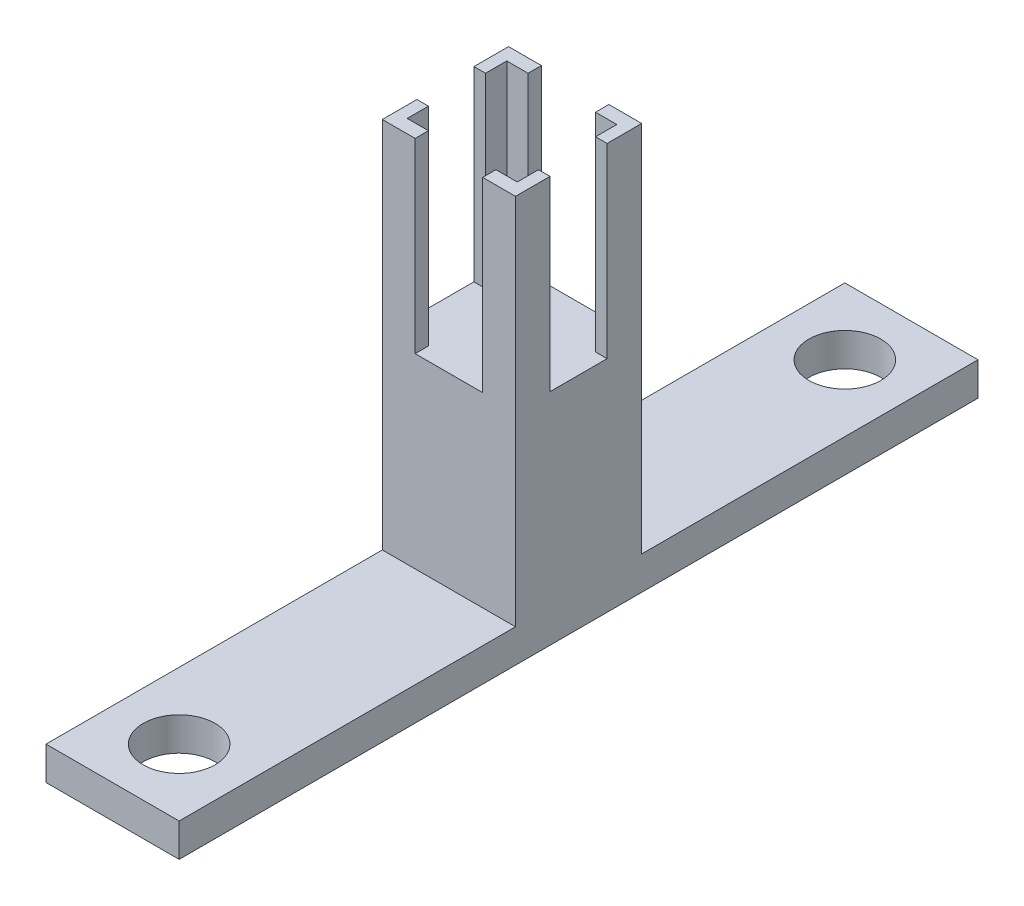
ISO-10303-21;
HEADER;
FILE_DESCRIPTION(('STEP AP214'),'2;1');
FILE_NAME('part.step','',(''),(''),'','','');
FILE_SCHEMA(('AUTOMOTIVE_DESIGN { 1 0 10303 214 1 1 1 1 }'));
ENDSEC;
DATA;
#1=APPLICATION_CONTEXT('core data for automotive mechanical design processes');
#2=APPLICATION_PROTOCOL_DEFINITION('international standard','automotive_design',2000,#1);
#3=PRODUCT_CONTEXT('',#1,'mechanical');
#4=PRODUCT('Part','Part','',(#3));
#5=PRODUCT_RELATED_PRODUCT_CATEGORY('part','',(#4));
#6=PRODUCT_DEFINITION_FORMATION('','',#4);
#7=PRODUCT_DEFINITION_CONTEXT('part definition',#1,'design');
#8=PRODUCT_DEFINITION('design','',#6,#7);
#9=PRODUCT_DEFINITION_SHAPE('','',#8);
#10=(LENGTH_UNIT() NAMED_UNIT(*) SI_UNIT(.MILLI.,.METRE.));
#11=(NAMED_UNIT(*) PLANE_ANGLE_UNIT() SI_UNIT($,.RADIAN.));
#12=(NAMED_UNIT(*) SI_UNIT($,.STERADIAN.) SOLID_ANGLE_UNIT());
#13=UNCERTAINTY_MEASURE_WITH_UNIT(LENGTH_MEASURE(1.E-05),#10,'distance_accuracy_value','');
#14=(GEOMETRIC_REPRESENTATION_CONTEXT(3) GLOBAL_UNCERTAINTY_ASSIGNED_CONTEXT((#13)) GLOBAL_UNIT_ASSIGNED_CONTEXT((#10,
#11,#12)) REPRESENTATION_CONTEXT('',''));
#15=CARTESIAN_POINT('',(0.,0.,0.));
#16=DIRECTION('',(0.,0.,1.));
#17=DIRECTION('',(1.,0.,0.));
#18=AXIS2_PLACEMENT_3D('',#15,#16,#17);
#19=CARTESIAN_POINT('',(0.,0.,0.));
#20=DIRECTION('',(0.,-1.,0.));
#21=DIRECTION('',(0.,0.,-1.));
#22=AXIS2_PLACEMENT_3D('',#19,#20,#21);
#23=PLANE('',#22);
#24=DIRECTION('',(0.,0.,1.));
#25=VECTOR('',#24,1.);
#26=CARTESIAN_POINT('',(6.35,0.,0.));
#27=LINE('',#26,#25);
#28=CARTESIAN_POINT('',(6.35,0.,-2.718));
#29=VERTEX_POINT('',#28);
#30=CARTESIAN_POINT('',(6.35,0.,2.718));
#31=VERTEX_POINT('',#30);
#32=EDGE_CURVE('E331',#29,#31,#27,.T.);
#33=ORIENTED_EDGE('',*,*,#32,.F.);
#34=DIRECTION('',(1.,0.,0.));
#35=VECTOR('',#34,1.);
#36=CARTESIAN_POINT('',(5.25,0.,-2.718));
#37=LINE('',#36,#35);
#38=CARTESIAN_POINT('',(5.25,0.,-2.718));
#39=VERTEX_POINT('',#38);
#40=EDGE_CURVE('E309',#39,#29,#37,.T.);
#41=ORIENTED_EDGE('',*,*,#40,.F.);
#42=DIRECTION('',(0.,0.,1.));
#43=VECTOR('',#42,1.);
#44=CARTESIAN_POINT('',(5.25,0.,-4.75));
#45=LINE('',#44,#43);
#46=CARTESIAN_POINT('',(5.25,0.,-4.75));
#47=VERTEX_POINT('',#46);
#48=EDGE_CURVE('E306',#47,#39,#45,.T.);
#49=ORIENTED_EDGE('',*,*,#48,.F.);
#50=DIRECTION('',(1.,0.,0.));
#51=VECTOR('',#50,1.);
#52=CARTESIAN_POINT('',(3.218,0.,-4.75));
#53=LINE('',#52,#51);
#54=CARTESIAN_POINT('',(3.218,0.,-4.75));
#55=VERTEX_POINT('',#54);
#56=EDGE_CURVE('E287',#55,#47,#53,.T.);
#57=ORIENTED_EDGE('',*,*,#56,.F.);
#58=DIRECTION('',(0.,0.,1.));
#59=VECTOR('',#58,1.);
#60=CARTESIAN_POINT('',(3.218,0.,-6.02));
#61=LINE('',#60,#59);
#62=CARTESIAN_POINT('',(3.218,0.,-6.02));
#63=VERTEX_POINT('',#62);
#64=EDGE_CURVE('E294',#63,#55,#61,.T.);
#65=ORIENTED_EDGE('',*,*,#64,.F.);
#66=DIRECTION('',(1.,0.,0.));
#67=VECTOR('',#66,1.);
#68=CARTESIAN_POINT('',(-6.52,0.,-6.02));
#69=LINE('',#68,#67);
#70=CARTESIAN_POINT('',(-3.218,0.,-6.02));
#71=VERTEX_POINT('',#70);
#72=EDGE_CURVE('E280',#71,#63,#69,.T.);
#73=ORIENTED_EDGE('',*,*,#72,.F.);
#74=DIRECTION('',(0.,0.,-1.));
#75=VECTOR('',#74,1.);
#76=CARTESIAN_POINT('',(-3.218,0.,-6.02));
#77=LINE('',#76,#75);
#78=CARTESIAN_POINT('',(-3.218,0.,-4.75));
#79=VERTEX_POINT('',#78);
#80=EDGE_CURVE('E433',#79,#71,#77,.T.);
#81=ORIENTED_EDGE('',*,*,#80,.F.);
#82=DIRECTION('',(1.,0.,0.));
#83=VECTOR('',#82,1.);
#84=CARTESIAN_POINT('',(-3.218,0.,-4.75));
#85=LINE('',#84,#83);
#86=CARTESIAN_POINT('',(-5.25,0.,-4.75));
#87=VERTEX_POINT('',#86);
#88=EDGE_CURVE('E416',#87,#79,#85,.T.);
#89=ORIENTED_EDGE('',*,*,#88,.F.);
#90=DIRECTION('',(0.,0.,-1.));
#91=VECTOR('',#90,1.);
#92=CARTESIAN_POINT('',(-5.25,0.,-4.75));
#93=LINE('',#92,#91);
#94=CARTESIAN_POINT('',(-5.25,0.,-2.718));
#95=VERTEX_POINT('',#94);
#96=EDGE_CURVE('E421',#95,#87,#93,.T.);
#97=ORIENTED_EDGE('',*,*,#96,.F.);
#98=DIRECTION('',(1.,0.,0.));
#99=VECTOR('',#98,1.);
#100=CARTESIAN_POINT('',(-5.25,0.,-2.718));
#101=LINE('',#100,#99);
#102=CARTESIAN_POINT('',(-6.35,0.,-2.718));
#103=VERTEX_POINT('',#102);
#104=EDGE_CURVE('E435',#103,#95,#101,.T.);
#105=ORIENTED_EDGE('',*,*,#104,.F.);
#106=DIRECTION('',(0.,0.,-1.));
#107=VECTOR('',#106,1.);
#108=CARTESIAN_POINT('',(-6.35,0.,0.));
#109=LINE('',#108,#107);
#110=CARTESIAN_POINT('',(-6.35,0.,2.718));
#111=VERTEX_POINT('',#110);
#112=EDGE_CURVE('E457',#111,#103,#109,.T.);
#113=ORIENTED_EDGE('',*,*,#112,.F.);
#114=DIRECTION('',(-1.,0.,0.));
#115=VECTOR('',#114,1.);
#116=CARTESIAN_POINT('',(-5.25,0.,2.718));
#117=LINE('',#116,#115);
#118=CARTESIAN_POINT('',(-5.25,0.,2.718));
#119=VERTEX_POINT('',#118);
#120=EDGE_CURVE('E264',#119,#111,#117,.T.);
#121=ORIENTED_EDGE('',*,*,#120,.F.);
#122=DIRECTION('',(0.,0.,-1.));
#123=VECTOR('',#122,1.);
#124=CARTESIAN_POINT('',(-5.25,0.,4.75));
#125=LINE('',#124,#123);
#126=CARTESIAN_POINT('',(-5.25,0.,4.75));
#127=VERTEX_POINT('',#126);
#128=EDGE_CURVE('E260',#127,#119,#125,.T.);
#129=ORIENTED_EDGE('',*,*,#128,.F.);
#130=DIRECTION('',(-1.,0.,0.));
#131=VECTOR('',#130,1.);
#132=CARTESIAN_POINT('',(-3.218,0.,4.75));
#133=LINE('',#132,#131);
#134=CARTESIAN_POINT('',(-3.218,0.,4.75));
#135=VERTEX_POINT('',#134);
#136=EDGE_CURVE('E257',#135,#127,#133,.T.);
#137=ORIENTED_EDGE('',*,*,#136,.F.);
#138=DIRECTION('',(0.,0.,-1.));
#139=VECTOR('',#138,1.);
#140=CARTESIAN_POINT('',(-3.218,0.,6.02));
#141=LINE('',#140,#139);
#142=CARTESIAN_POINT('',(-3.218,0.,6.02));
#143=VERTEX_POINT('',#142);
#144=EDGE_CURVE('E267',#143,#135,#141,.T.);
#145=ORIENTED_EDGE('',*,*,#144,.F.);
#146=DIRECTION('',(-1.,0.,0.));
#147=VECTOR('',#146,1.);
#148=CARTESIAN_POINT('',(-6.52,0.,6.02));
#149=LINE('',#148,#147);
#150=CARTESIAN_POINT('',(3.218,0.,6.02));
#151=VERTEX_POINT('',#150);
#152=EDGE_CURVE('E285',#151,#143,#149,.T.);
#153=ORIENTED_EDGE('',*,*,#152,.F.);
#154=DIRECTION('',(0.,0.,1.));
#155=VECTOR('',#154,1.);
#156=CARTESIAN_POINT('',(3.218,0.,6.02));
#157=LINE('',#156,#155);
#158=CARTESIAN_POINT('',(3.218,0.,4.75));
#159=VERTEX_POINT('',#158);
#160=EDGE_CURVE('E402',#159,#151,#157,.T.);
#161=ORIENTED_EDGE('',*,*,#160,.F.);
#162=DIRECTION('',(-1.,0.,0.));
#163=VECTOR('',#162,1.);
#164=CARTESIAN_POINT('',(3.218,0.,4.75));
#165=LINE('',#164,#163);
#166=CARTESIAN_POINT('',(5.25,0.,4.75));
#167=VERTEX_POINT('',#166);
#168=EDGE_CURVE('E385',#167,#159,#165,.T.);
#169=ORIENTED_EDGE('',*,*,#168,.F.);
#170=DIRECTION('',(0.,0.,1.));
#171=VECTOR('',#170,1.);
#172=CARTESIAN_POINT('',(5.25,0.,4.75));
#173=LINE('',#172,#171);
#174=CARTESIAN_POINT('',(5.25,0.,2.718));
#175=VERTEX_POINT('',#174);
#176=EDGE_CURVE('E390',#175,#167,#173,.T.);
#177=ORIENTED_EDGE('',*,*,#176,.F.);
#178=DIRECTION('',(-1.,0.,0.));
#179=VECTOR('',#178,1.);
#180=CARTESIAN_POINT('',(5.25,0.,2.718));
#181=LINE('',#180,#179);
#182=EDGE_CURVE('E333',#31,#175,#181,.T.);
#183=ORIENTED_EDGE('',*,*,#182,.F.);
#184=EDGE_LOOP('',(#33,#41,#49,#57,#65,#73,#81,#89,#97,#105,#113,#121,#129,#137,#145,#153,#161,
#169,#177,#183));
#185=FACE_BOUND('',#184,.T.);
#186=ADVANCED_FACE('F36',(#185),#23,.F.);
#187=CARTESIAN_POINT('',(5.25,17.78,-2.718));
#188=DIRECTION('',(0.,0.,-1.));
#189=DIRECTION('',(-1.,0.,0.));
#190=AXIS2_PLACEMENT_3D('',#187,#188,#189);
#191=PLANE('',#190);
#192=DIRECTION('',(0.,-1.,0.));
#193=VECTOR('',#192,1.);
#194=CARTESIAN_POINT('',(6.35,17.78,-2.718));
#195=LINE('',#194,#193);
#196=CARTESIAN_POINT('',(6.35,17.78,-2.71800000000001));
#197=VERTEX_POINT('',#196);
#198=EDGE_CURVE('E334',#197,#29,#195,.T.);
#199=ORIENTED_EDGE('',*,*,#198,.F.);
#200=DIRECTION('',(1.,0.,0.));
#201=VECTOR('',#200,1.);
#202=CARTESIAN_POINT('',(5.25,17.78,-2.718));
#203=LINE('',#202,#201);
#204=CARTESIAN_POINT('',(5.25,17.78,-2.718));
#205=VERTEX_POINT('',#204);
#206=EDGE_CURVE('E296',#205,#197,#203,.T.);
#207=ORIENTED_EDGE('',*,*,#206,.F.);
#208=DIRECTION('',(0.,-1.,0.));
#209=VECTOR('',#208,1.);
#210=CARTESIAN_POINT('',(5.25,17.78,-2.718));
#211=LINE('',#210,#209);
#212=EDGE_CURVE('E44',#205,#39,#211,.T.);
#213=ORIENTED_EDGE('',*,*,#212,.T.);
#214=ORIENTED_EDGE('',*,*,#40,.T.);
#215=EDGE_LOOP('',(#199,#207,#213,#214));
#216=FACE_BOUND('',#215,.T.);
#217=ADVANCED_FACE('F323',(#216),#191,.F.);
#218=CARTESIAN_POINT('',(6.52,17.78,-6.02));
#219=DIRECTION('',(0.,0.,1.));
#220=DIRECTION('',(1.,0.,0.));
#221=AXIS2_PLACEMENT_3D('',#218,#219,#220);
#222=PLANE('',#221);
#223=DIRECTION('',(0.,1.,0.));
#224=VECTOR('',#223,1.);
#225=CARTESIAN_POINT('',(6.35,17.78,-6.02));
#226=LINE('',#225,#224);
#227=CARTESIAN_POINT('',(6.35,-17.78,-6.02));
#228=VERTEX_POINT('',#227);
#229=CARTESIAN_POINT('',(6.35,17.78,-6.02000000000002));
#230=VERTEX_POINT('',#229);
#231=EDGE_CURVE('E338',#228,#230,#226,.T.);
#232=ORIENTED_EDGE('',*,*,#231,.F.);
#233=DIRECTION('',(1.,0.,0.));
#234=VECTOR('',#233,1.);
#235=CARTESIAN_POINT('',(-6.52,-17.78,-6.02));
#236=LINE('',#235,#234);
#237=CARTESIAN_POINT('',(-6.35,-17.78,-6.01999999999998));
#238=VERTEX_POINT('',#237);
#239=EDGE_CURVE('E281',#238,#228,#236,.T.);
#240=ORIENTED_EDGE('',*,*,#239,.F.);
#241=DIRECTION('',(0.,-1.,0.));
#242=VECTOR('',#241,1.);
#243=CARTESIAN_POINT('',(-6.35,17.78,-6.02));
#244=LINE('',#243,#242);
#245=CARTESIAN_POINT('',(-6.35,17.78,-6.01999999999998));
#246=VERTEX_POINT('',#245);
#247=EDGE_CURVE('E231',#246,#238,#244,.T.);
#248=ORIENTED_EDGE('',*,*,#247,.F.);
#249=DIRECTION('',(-1.,0.,0.));
#250=VECTOR('',#249,1.);
#251=CARTESIAN_POINT('',(-6.52,17.78,-6.02));
#252=LINE('',#251,#250);
#253=CARTESIAN_POINT('',(-3.218,17.78,-6.02));
#254=VERTEX_POINT('',#253);
#255=EDGE_CURVE('E423',#254,#246,#252,.T.);
#256=ORIENTED_EDGE('',*,*,#255,.F.);
#257=DIRECTION('',(0.,-1.,0.));
#258=VECTOR('',#257,1.);
#259=CARTESIAN_POINT('',(-3.218,17.78,-6.02));
#260=LINE('',#259,#258);
#261=EDGE_CURVE('E443',#254,#71,#260,.T.);
#262=ORIENTED_EDGE('',*,*,#261,.T.);
#263=ORIENTED_EDGE('',*,*,#72,.T.);
#264=DIRECTION('',(0.,-1.,0.));
#265=VECTOR('',#264,1.);
#266=CARTESIAN_POINT('',(3.218,17.78,-6.02));
#267=LINE('',#266,#265);
#268=CARTESIAN_POINT('',(3.218,17.78,-6.02));
#269=VERTEX_POINT('',#268);
#270=EDGE_CURVE('E316',#269,#63,#267,.T.);
#271=ORIENTED_EDGE('',*,*,#270,.F.);
#272=DIRECTION('',(-1.,0.,0.));
#273=VECTOR('',#272,1.);
#274=CARTESIAN_POINT('',(6.52,17.78,-6.02));
#275=LINE('',#274,#273);
#276=EDGE_CURVE('E299',#230,#269,#275,.T.);
#277=ORIENTED_EDGE('',*,*,#276,.F.);
#278=EDGE_LOOP('',(#232,#240,#248,#256,#262,#263,#271,#277));
#279=FACE_BOUND('',#278,.T.);
#280=ADVANCED_FACE('F469',(#279),#222,.F.);
#281=CARTESIAN_POINT('',(0.,17.78,0.));
#282=DIRECTION('',(0.,-1.,0.));
#283=DIRECTION('',(0.,0.,-1.));
#284=AXIS2_PLACEMENT_3D('',#281,#282,#283);
#285=PLANE('',#284);
#286=DIRECTION('',(0.,0.,1.));
#287=VECTOR('',#286,1.);
#288=CARTESIAN_POINT('',(6.35,17.78,-38.1));
#289=LINE('',#288,#287);
#290=EDGE_CURVE('E232',#230,#197,#289,.T.);
#291=ORIENTED_EDGE('',*,*,#290,.F.);
#292=ORIENTED_EDGE('',*,*,#276,.T.);
#293=DIRECTION('',(0.,0.,1.));
#294=VECTOR('',#293,1.);
#295=CARTESIAN_POINT('',(3.218,17.78,-6.02));
#296=LINE('',#295,#294);
#297=CARTESIAN_POINT('',(3.218,17.78,-4.75));
#298=VERTEX_POINT('',#297);
#299=EDGE_CURVE('E301',#269,#298,#296,.T.);
#300=ORIENTED_EDGE('',*,*,#299,.T.);
#301=DIRECTION('',(1.,0.,0.));
#302=VECTOR('',#301,1.);
#303=CARTESIAN_POINT('',(3.218,17.78,-4.75));
#304=LINE('',#303,#302);
#305=CARTESIAN_POINT('',(5.25,17.78,-4.75));
#306=VERTEX_POINT('',#305);
#307=EDGE_CURVE('E290',#298,#306,#304,.T.);
#308=ORIENTED_EDGE('',*,*,#307,.T.);
#309=DIRECTION('',(0.,0.,1.));
#310=VECTOR('',#309,1.);
#311=CARTESIAN_POINT('',(5.25,17.78,-4.75));
#312=LINE('',#311,#310);
#313=EDGE_CURVE('E293',#306,#205,#312,.T.);
#314=ORIENTED_EDGE('',*,*,#313,.T.);
#315=ORIENTED_EDGE('',*,*,#206,.T.);
#316=EDGE_LOOP('',(#291,#292,#300,#308,#314,#315));
#317=FACE_BOUND('',#316,.T.);
#318=ADVANCED_FACE('F488',(#317),#285,.F.);
#319=CARTESIAN_POINT('',(-6.52,-17.78,6.02));
#320=DIRECTION('',(0.,0.,-1.));
#321=DIRECTION('',(-1.,0.,0.));
#322=AXIS2_PLACEMENT_3D('',#319,#320,#321);
#323=PLANE('',#322);
#324=DIRECTION('',(0.,-1.,0.));
#325=VECTOR('',#324,1.);
#326=CARTESIAN_POINT('',(6.35,-17.78,6.02));
#327=LINE('',#326,#325);
#328=CARTESIAN_POINT('',(6.35,17.78,6.01999999999999));
#329=VERTEX_POINT('',#328);
#330=CARTESIAN_POINT('',(6.35,-17.78,6.02000000000003));
#331=VERTEX_POINT('',#330);
#332=EDGE_CURVE('E336',#329,#331,#327,.T.);
#333=ORIENTED_EDGE('',*,*,#332,.F.);
#334=DIRECTION('',(1.,0.,0.));
#335=VECTOR('',#334,1.);
#336=CARTESIAN_POINT('',(6.52,17.78,6.02));
#337=LINE('',#336,#335);
#338=CARTESIAN_POINT('',(3.218,17.78,6.02));
#339=VERTEX_POINT('',#338);
#340=EDGE_CURVE('E392',#339,#329,#337,.T.);
#341=ORIENTED_EDGE('',*,*,#340,.F.);
#342=DIRECTION('',(0.,-1.,0.));
#343=VECTOR('',#342,1.);
#344=CARTESIAN_POINT('',(3.218,17.78,6.02));
#345=LINE('',#344,#343);
#346=EDGE_CURVE('E412',#339,#151,#345,.T.);
#347=ORIENTED_EDGE('',*,*,#346,.T.);
#348=ORIENTED_EDGE('',*,*,#152,.T.);
#349=DIRECTION('',(0.,-1.,0.));
#350=VECTOR('',#349,1.);
#351=CARTESIAN_POINT('',(-3.218,17.78,6.02));
#352=LINE('',#351,#350);
#353=CARTESIAN_POINT('',(-3.218,17.78,6.02));
#354=VERTEX_POINT('',#353);
#355=EDGE_CURVE('E247',#354,#143,#352,.T.);
#356=ORIENTED_EDGE('',*,*,#355,.F.);
#357=DIRECTION('',(1.,0.,0.));
#358=VECTOR('',#357,1.);
#359=CARTESIAN_POINT('',(-6.52,17.78,6.02));
#360=LINE('',#359,#358);
#361=CARTESIAN_POINT('',(-6.35,17.78,6.02000000000002));
#362=VERTEX_POINT('',#361);
#363=EDGE_CURVE('E237',#362,#354,#360,.T.);
#364=ORIENTED_EDGE('',*,*,#363,.F.);
#365=DIRECTION('',(0.,1.,0.));
#366=VECTOR('',#365,1.);
#367=CARTESIAN_POINT('',(-6.35,-17.78,6.02));
#368=LINE('',#367,#366);
#369=CARTESIAN_POINT('',(-6.35,-17.78,6.02000000000003));
#370=VERTEX_POINT('',#369);
#371=EDGE_CURVE('E219',#370,#362,#368,.T.);
#372=ORIENTED_EDGE('',*,*,#371,.F.);
#373=DIRECTION('',(-1.,0.,0.));
#374=VECTOR('',#373,1.);
#375=CARTESIAN_POINT('',(-6.52,-17.78,6.02));
#376=LINE('',#375,#374);
#377=EDGE_CURVE('E284',#331,#370,#376,.T.);
#378=ORIENTED_EDGE('',*,*,#377,.F.);
#379=EDGE_LOOP('',(#333,#341,#347,#348,#356,#364,#372,#378));
#380=FACE_BOUND('',#379,.T.);
#381=ADVANCED_FACE('F245',(#380),#323,.F.);
#382=CARTESIAN_POINT('',(-5.25,17.78,2.718));
#383=DIRECTION('',(0.,0.,1.));
#384=DIRECTION('',(1.,0.,0.));
#385=AXIS2_PLACEMENT_3D('',#382,#383,#384);
#386=PLANE('',#385);
#387=DIRECTION('',(0.,-1.,0.));
#388=VECTOR('',#387,1.);
#389=CARTESIAN_POINT('',(-6.35,17.78,2.718));
#390=LINE('',#389,#388);
#391=CARTESIAN_POINT('',(-6.35,17.78,2.71800000000002));
#392=VERTEX_POINT('',#391);
#393=EDGE_CURVE('E455',#392,#111,#390,.T.);
#394=ORIENTED_EDGE('',*,*,#393,.F.);
#395=DIRECTION('',(-1.,0.,0.));
#396=VECTOR('',#395,1.);
#397=CARTESIAN_POINT('',(-5.25,17.78,2.718));
#398=LINE('',#397,#396);
#399=CARTESIAN_POINT('',(-5.25,17.78,2.718));
#400=VERTEX_POINT('',#399);
#401=EDGE_CURVE('E240',#400,#392,#398,.T.);
#402=ORIENTED_EDGE('',*,*,#401,.F.);
#403=DIRECTION('',(0.,-1.,0.));
#404=VECTOR('',#403,1.);
#405=CARTESIAN_POINT('',(-5.25,17.78,2.718));
#406=LINE('',#405,#404);
#407=EDGE_CURVE('E274',#400,#119,#406,.T.);
#408=ORIENTED_EDGE('',*,*,#407,.T.);
#409=ORIENTED_EDGE('',*,*,#120,.T.);
#410=EDGE_LOOP('',(#394,#402,#408,#409));
#411=FACE_BOUND('',#410,.T.);
#412=ADVANCED_FACE('F454',(#411),#386,.F.);
#413=CARTESIAN_POINT('',(0.,17.78,0.));
#414=DIRECTION('',(0.,-1.,0.));
#415=DIRECTION('',(0.,0.,-1.));
#416=AXIS2_PLACEMENT_3D('',#413,#414,#415);
#417=PLANE('',#416);
#418=DIRECTION('',(0.,0.,-1.));
#419=VECTOR('',#418,1.);
#420=CARTESIAN_POINT('',(-6.35,17.78,38.1));
#421=LINE('',#420,#419);
#422=EDGE_CURVE('E222',#362,#392,#421,.T.);
#423=ORIENTED_EDGE('',*,*,#422,.F.);
#424=ORIENTED_EDGE('',*,*,#363,.T.);
#425=DIRECTION('',(0.,0.,-1.));
#426=VECTOR('',#425,1.);
#427=CARTESIAN_POINT('',(-3.218,17.78,6.02));
#428=LINE('',#427,#426);
#429=CARTESIAN_POINT('',(-3.218,17.78,4.75));
#430=VERTEX_POINT('',#429);
#431=EDGE_CURVE('E249',#354,#430,#428,.T.);
#432=ORIENTED_EDGE('',*,*,#431,.T.);
#433=DIRECTION('',(-1.,0.,0.));
#434=VECTOR('',#433,1.);
#435=CARTESIAN_POINT('',(-3.218,17.78,4.75));
#436=LINE('',#435,#434);
#437=CARTESIAN_POINT('',(-5.25,17.78,4.75));
#438=VERTEX_POINT('',#437);
#439=EDGE_CURVE('E270',#430,#438,#436,.T.);
#440=ORIENTED_EDGE('',*,*,#439,.T.);
#441=DIRECTION('',(0.,0.,-1.));
#442=VECTOR('',#441,1.);
#443=CARTESIAN_POINT('',(-5.25,17.78,4.75));
#444=LINE('',#443,#442);
#445=EDGE_CURVE('E253',#438,#400,#444,.T.);
#446=ORIENTED_EDGE('',*,*,#445,.T.);
#447=ORIENTED_EDGE('',*,*,#401,.T.);
#448=EDGE_LOOP('',(#423,#424,#432,#440,#446,#447));
#449=FACE_BOUND('',#448,.T.);
#450=ADVANCED_FACE('F236',(#449),#417,.F.);
#451=CARTESIAN_POINT('',(-5.25,17.78,-2.718));
#452=DIRECTION('',(0.,0.,-1.));
#453=DIRECTION('',(-1.,0.,0.));
#454=AXIS2_PLACEMENT_3D('',#451,#452,#453);
#455=PLANE('',#454);
#456=DIRECTION('',(0.,1.,0.));
#457=VECTOR('',#456,1.);
#458=CARTESIAN_POINT('',(-6.35,17.78,-2.718));
#459=LINE('',#458,#457);
#460=CARTESIAN_POINT('',(-6.35,17.78,-2.718));
#461=VERTEX_POINT('',#460);
#462=EDGE_CURVE('E51',#103,#461,#459,.T.);
#463=ORIENTED_EDGE('',*,*,#462,.F.);
#464=ORIENTED_EDGE('',*,*,#104,.T.);
#465=DIRECTION('',(0.,-1.,0.));
#466=VECTOR('',#465,1.);
#467=CARTESIAN_POINT('',(-5.25,17.78,-2.718));
#468=LINE('',#467,#466);
#469=CARTESIAN_POINT('',(-5.25,17.78,-2.718));
#470=VERTEX_POINT('',#469);
#471=EDGE_CURVE('E440',#470,#95,#468,.T.);
#472=ORIENTED_EDGE('',*,*,#471,.F.);
#473=DIRECTION('',(1.,0.,0.));
#474=VECTOR('',#473,1.);
#475=CARTESIAN_POINT('',(-5.25,17.78,-2.718));
#476=LINE('',#475,#474);
#477=EDGE_CURVE('E426',#461,#470,#476,.T.);
#478=ORIENTED_EDGE('',*,*,#477,.F.);
#479=EDGE_LOOP('',(#463,#464,#472,#478));
#480=FACE_BOUND('',#479,.T.);
#481=ADVANCED_FACE('F582',(#480),#455,.F.);
#482=CARTESIAN_POINT('',(0.,17.78,0.));
#483=DIRECTION('',(0.,1.,0.));
#484=DIRECTION('',(0.,0.,1.));
#485=AXIS2_PLACEMENT_3D('',#482,#483,#484);
#486=PLANE('',#485);
#487=ORIENTED_EDGE('',*,*,#255,.T.);
#488=EDGE_CURVE('E242',#461,#246,#421,.T.);
#489=ORIENTED_EDGE('',*,*,#488,.F.);
#490=ORIENTED_EDGE('',*,*,#477,.T.);
#491=DIRECTION('',(0.,0.,-1.));
#492=VECTOR('',#491,1.);
#493=CARTESIAN_POINT('',(-5.25,17.78,-4.75));
#494=LINE('',#493,#492);
#495=CARTESIAN_POINT('',(-5.25,17.78,-4.75));
#496=VERTEX_POINT('',#495);
#497=EDGE_CURVE('E428',#470,#496,#494,.T.);
#498=ORIENTED_EDGE('',*,*,#497,.T.);
#499=DIRECTION('',(1.,0.,0.));
#500=VECTOR('',#499,1.);
#501=CARTESIAN_POINT('',(-3.218,17.78,-4.75));
#502=LINE('',#501,#500);
#503=CARTESIAN_POINT('',(-3.218,17.78,-4.75));
#504=VERTEX_POINT('',#503);
#505=EDGE_CURVE('E417',#496,#504,#502,.T.);
#506=ORIENTED_EDGE('',*,*,#505,.T.);
#507=DIRECTION('',(0.,0.,-1.));
#508=VECTOR('',#507,1.);
#509=CARTESIAN_POINT('',(-3.218,17.78,-6.02));
#510=LINE('',#509,#508);
#511=EDGE_CURVE('E420',#504,#254,#510,.T.);
#512=ORIENTED_EDGE('',*,*,#511,.T.);
#513=EDGE_LOOP('',(#487,#489,#490,#498,#506,#512));
#514=FACE_BOUND('',#513,.T.);
#515=ADVANCED_FACE('F471',(#514),#486,.T.);
#516=CARTESIAN_POINT('',(5.25,17.78,2.718));
#517=DIRECTION('',(0.,0.,1.));
#518=DIRECTION('',(1.,0.,0.));
#519=AXIS2_PLACEMENT_3D('',#516,#517,#518);
#520=PLANE('',#519);
#521=DIRECTION('',(0.,1.,0.));
#522=VECTOR('',#521,1.);
#523=CARTESIAN_POINT('',(6.35,17.78,2.718));
#524=LINE('',#523,#522);
#525=CARTESIAN_POINT('',(6.35,17.78,2.718));
#526=VERTEX_POINT('',#525);
#527=EDGE_CURVE('E59',#31,#526,#524,.T.);
#528=ORIENTED_EDGE('',*,*,#527,.F.);
#529=ORIENTED_EDGE('',*,*,#182,.T.);
#530=DIRECTION('',(0.,-1.,0.));
#531=VECTOR('',#530,1.);
#532=CARTESIAN_POINT('',(5.25,17.78,2.718));
#533=LINE('',#532,#531);
#534=CARTESIAN_POINT('',(5.25,17.78,2.718));
#535=VERTEX_POINT('',#534);
#536=EDGE_CURVE('E409',#535,#175,#533,.T.);
#537=ORIENTED_EDGE('',*,*,#536,.F.);
#538=DIRECTION('',(-1.,0.,0.));
#539=VECTOR('',#538,1.);
#540=CARTESIAN_POINT('',(5.25,17.78,2.718));
#541=LINE('',#540,#539);
#542=EDGE_CURVE('E395',#526,#535,#541,.T.);
#543=ORIENTED_EDGE('',*,*,#542,.F.);
#544=EDGE_LOOP('',(#528,#529,#537,#543));
#545=FACE_BOUND('',#544,.T.);
#546=ADVANCED_FACE('F558',(#545),#520,.F.);
#547=CARTESIAN_POINT('',(0.,17.78,0.));
#548=DIRECTION('',(0.,1.,0.));
#549=DIRECTION('',(0.,0.,1.));
#550=AXIS2_PLACEMENT_3D('',#547,#548,#549);
#551=PLANE('',#550);
#552=ORIENTED_EDGE('',*,*,#340,.T.);
#553=EDGE_CURVE('E241',#526,#329,#289,.T.);
#554=ORIENTED_EDGE('',*,*,#553,.F.);
#555=ORIENTED_EDGE('',*,*,#542,.T.);
#556=DIRECTION('',(0.,0.,1.));
#557=VECTOR('',#556,1.);
#558=CARTESIAN_POINT('',(5.25,17.78,4.75));
#559=LINE('',#558,#557);
#560=CARTESIAN_POINT('',(5.25,17.78,4.75));
#561=VERTEX_POINT('',#560);
#562=EDGE_CURVE('E397',#535,#561,#559,.T.);
#563=ORIENTED_EDGE('',*,*,#562,.T.);
#564=DIRECTION('',(-1.,0.,0.));
#565=VECTOR('',#564,1.);
#566=CARTESIAN_POINT('',(3.218,17.78,4.75));
#567=LINE('',#566,#565);
#568=CARTESIAN_POINT('',(3.218,17.78,4.75));
#569=VERTEX_POINT('',#568);
#570=EDGE_CURVE('E386',#561,#569,#567,.T.);
#571=ORIENTED_EDGE('',*,*,#570,.T.);
#572=DIRECTION('',(0.,0.,1.));
#573=VECTOR('',#572,1.);
#574=CARTESIAN_POINT('',(3.218,17.78,6.02));
#575=LINE('',#574,#573);
#576=EDGE_CURVE('E389',#569,#339,#575,.T.);
#577=ORIENTED_EDGE('',*,*,#576,.T.);
#578=EDGE_LOOP('',(#552,#554,#555,#563,#571,#577));
#579=FACE_BOUND('',#578,.T.);
#580=ADVANCED_FACE('F515',(#579),#551,.T.);
#581=CARTESIAN_POINT('',(3.218,17.78,-4.75));
#582=DIRECTION('',(0.,0.,-1.));
#583=DIRECTION('',(-1.,0.,0.));
#584=AXIS2_PLACEMENT_3D('',#581,#582,#583);
#585=PLANE('',#584);
#586=ORIENTED_EDGE('',*,*,#56,.T.);
#587=DIRECTION('',(0.,-1.,0.));
#588=VECTOR('',#587,1.);
#589=CARTESIAN_POINT('',(5.25,17.78,-4.75));
#590=LINE('',#589,#588);
#591=EDGE_CURVE('E12',#306,#47,#590,.T.);
#592=ORIENTED_EDGE('',*,*,#591,.F.);
#593=ORIENTED_EDGE('',*,*,#307,.F.);
#594=DIRECTION('',(0.,-1.,0.));
#595=VECTOR('',#594,1.);
#596=CARTESIAN_POINT('',(3.218,17.78,-4.75));
#597=LINE('',#596,#595);
#598=EDGE_CURVE('E303',#298,#55,#597,.T.);
#599=ORIENTED_EDGE('',*,*,#598,.T.);
#600=EDGE_LOOP('',(#586,#592,#593,#599));
#601=FACE_BOUND('',#600,.T.);
#602=ADVANCED_FACE('F38',(#601),#585,.F.);
#603=CARTESIAN_POINT('',(5.25,17.78,-4.75));
#604=DIRECTION('',(1.,0.,0.));
#605=DIRECTION('',(0.,0.,-1.));
#606=AXIS2_PLACEMENT_3D('',#603,#604,#605);
#607=PLANE('',#606);
#608=ORIENTED_EDGE('',*,*,#48,.T.);
#609=ORIENTED_EDGE('',*,*,#212,.F.);
#610=ORIENTED_EDGE('',*,*,#313,.F.);
#611=ORIENTED_EDGE('',*,*,#591,.T.);
#612=EDGE_LOOP('',(#608,#609,#610,#611));
#613=FACE_BOUND('',#612,.T.);
#614=ADVANCED_FACE('F325',(#613),#607,.F.);
#615=CARTESIAN_POINT('',(3.218,17.78,-6.02));
#616=DIRECTION('',(1.,0.,0.));
#617=DIRECTION('',(0.,0.,-1.));
#618=AXIS2_PLACEMENT_3D('',#615,#616,#617);
#619=PLANE('',#618);
#620=ORIENTED_EDGE('',*,*,#64,.T.);
#621=ORIENTED_EDGE('',*,*,#598,.F.);
#622=ORIENTED_EDGE('',*,*,#299,.F.);
#623=ORIENTED_EDGE('',*,*,#270,.T.);
#624=EDGE_LOOP('',(#620,#621,#622,#623));
#625=FACE_BOUND('',#624,.T.);
#626=ADVANCED_FACE('F484',(#625),#619,.F.);
#627=CARTESIAN_POINT('',(-3.218,17.78,4.75));
#628=DIRECTION('',(0.,0.,1.));
#629=DIRECTION('',(1.,0.,0.));
#630=AXIS2_PLACEMENT_3D('',#627,#628,#629);
#631=PLANE('',#630);
#632=ORIENTED_EDGE('',*,*,#136,.T.);
#633=DIRECTION('',(0.,-1.,0.));
#634=VECTOR('',#633,1.);
#635=CARTESIAN_POINT('',(-5.25,17.78,4.75));
#636=LINE('',#635,#634);
#637=EDGE_CURVE('E277',#438,#127,#636,.T.);
#638=ORIENTED_EDGE('',*,*,#637,.F.);
#639=ORIENTED_EDGE('',*,*,#439,.F.);
#640=DIRECTION('',(0.,-1.,0.));
#641=VECTOR('',#640,1.);
#642=CARTESIAN_POINT('',(-3.218,17.78,4.75));
#643=LINE('',#642,#641);
#644=EDGE_CURVE('E251',#430,#135,#643,.T.);
#645=ORIENTED_EDGE('',*,*,#644,.T.);
#646=EDGE_LOOP('',(#632,#638,#639,#645));
#647=FACE_BOUND('',#646,.T.);
#648=ADVANCED_FACE('F529',(#647),#631,.F.);
#649=CARTESIAN_POINT('',(-5.25,17.78,4.75));
#650=DIRECTION('',(-1.,0.,0.));
#651=DIRECTION('',(0.,0.,1.));
#652=AXIS2_PLACEMENT_3D('',#649,#650,#651);
#653=PLANE('',#652);
#654=ORIENTED_EDGE('',*,*,#128,.T.);
#655=ORIENTED_EDGE('',*,*,#407,.F.);
#656=ORIENTED_EDGE('',*,*,#445,.F.);
#657=ORIENTED_EDGE('',*,*,#637,.T.);
#658=EDGE_LOOP('',(#654,#655,#656,#657));
#659=FACE_BOUND('',#658,.T.);
#660=ADVANCED_FACE('F452',(#659),#653,.F.);
#661=CARTESIAN_POINT('',(-3.218,17.78,6.02));
#662=DIRECTION('',(-1.,0.,0.));
#663=DIRECTION('',(0.,0.,1.));
#664=AXIS2_PLACEMENT_3D('',#661,#662,#663);
#665=PLANE('',#664);
#666=ORIENTED_EDGE('',*,*,#144,.T.);
#667=ORIENTED_EDGE('',*,*,#644,.F.);
#668=ORIENTED_EDGE('',*,*,#431,.F.);
#669=ORIENTED_EDGE('',*,*,#355,.T.);
#670=EDGE_LOOP('',(#666,#667,#668,#669));
#671=FACE_BOUND('',#670,.T.);
#672=ADVANCED_FACE('F527',(#671),#665,.F.);
#673=CARTESIAN_POINT('',(-3.218,17.78,-4.75));
#674=DIRECTION('',(0.,0.,-1.));
#675=DIRECTION('',(-1.,0.,0.));
#676=AXIS2_PLACEMENT_3D('',#673,#674,#675);
#677=PLANE('',#676);
#678=ORIENTED_EDGE('',*,*,#88,.T.);
#679=DIRECTION('',(0.,-1.,0.));
#680=VECTOR('',#679,1.);
#681=CARTESIAN_POINT('',(-3.218,17.78,-4.75));
#682=LINE('',#681,#680);
#683=EDGE_CURVE('E261',#504,#79,#682,.T.);
#684=ORIENTED_EDGE('',*,*,#683,.F.);
#685=ORIENTED_EDGE('',*,*,#505,.F.);
#686=DIRECTION('',(0.,-1.,0.));
#687=VECTOR('',#686,1.);
#688=CARTESIAN_POINT('',(-5.25,17.78,-4.75));
#689=LINE('',#688,#687);
#690=EDGE_CURVE('E430',#496,#87,#689,.T.);
#691=ORIENTED_EDGE('',*,*,#690,.T.);
#692=EDGE_LOOP('',(#678,#684,#685,#691));
#693=FACE_BOUND('',#692,.T.);
#694=ADVANCED_FACE('F591',(#693),#677,.F.);
#695=CARTESIAN_POINT('',(-3.218,17.78,-6.02));
#696=DIRECTION('',(-1.,0.,0.));
#697=DIRECTION('',(0.,0.,1.));
#698=AXIS2_PLACEMENT_3D('',#695,#696,#697);
#699=PLANE('',#698);
#700=ORIENTED_EDGE('',*,*,#80,.T.);
#701=ORIENTED_EDGE('',*,*,#261,.F.);
#702=ORIENTED_EDGE('',*,*,#511,.F.);
#703=ORIENTED_EDGE('',*,*,#683,.T.);
#704=EDGE_LOOP('',(#700,#701,#702,#703));
#705=FACE_BOUND('',#704,.T.);
#706=ADVANCED_FACE('F476',(#705),#699,.F.);
#707=CARTESIAN_POINT('',(-5.25,17.78,-4.75));
#708=DIRECTION('',(-1.,0.,0.));
#709=DIRECTION('',(0.,0.,1.));
#710=AXIS2_PLACEMENT_3D('',#707,#708,#709);
#711=PLANE('',#710);
#712=ORIENTED_EDGE('',*,*,#96,.T.);
#713=ORIENTED_EDGE('',*,*,#690,.F.);
#714=ORIENTED_EDGE('',*,*,#497,.F.);
#715=ORIENTED_EDGE('',*,*,#471,.T.);
#716=EDGE_LOOP('',(#712,#713,#714,#715));
#717=FACE_BOUND('',#716,.T.);
#718=ADVANCED_FACE('F578',(#717),#711,.F.);
#719=CARTESIAN_POINT('',(3.218,17.78,4.75));
#720=DIRECTION('',(0.,0.,1.));
#721=DIRECTION('',(1.,0.,0.));
#722=AXIS2_PLACEMENT_3D('',#719,#720,#721);
#723=PLANE('',#722);
#724=ORIENTED_EDGE('',*,*,#168,.T.);
#725=DIRECTION('',(0.,-1.,0.));
#726=VECTOR('',#725,1.);
#727=CARTESIAN_POINT('',(3.218,17.78,4.75));
#728=LINE('',#727,#726);
#729=EDGE_CURVE('E414',#569,#159,#728,.T.);
#730=ORIENTED_EDGE('',*,*,#729,.F.);
#731=ORIENTED_EDGE('',*,*,#570,.F.);
#732=DIRECTION('',(0.,-1.,0.));
#733=VECTOR('',#732,1.);
#734=CARTESIAN_POINT('',(5.25,17.78,4.75));
#735=LINE('',#734,#733);
#736=EDGE_CURVE('E399',#561,#167,#735,.T.);
#737=ORIENTED_EDGE('',*,*,#736,.T.);
#738=EDGE_LOOP('',(#724,#730,#731,#737));
#739=FACE_BOUND('',#738,.T.);
#740=ADVANCED_FACE('F575',(#739),#723,.F.);
#741=CARTESIAN_POINT('',(3.218,17.78,6.02));
#742=DIRECTION('',(1.,0.,0.));
#743=DIRECTION('',(0.,0.,-1.));
#744=AXIS2_PLACEMENT_3D('',#741,#742,#743);
#745=PLANE('',#744);
#746=ORIENTED_EDGE('',*,*,#160,.T.);
#747=ORIENTED_EDGE('',*,*,#346,.F.);
#748=ORIENTED_EDGE('',*,*,#576,.F.);
#749=ORIENTED_EDGE('',*,*,#729,.T.);
#750=EDGE_LOOP('',(#746,#747,#748,#749));
#751=FACE_BOUND('',#750,.T.);
#752=ADVANCED_FACE('F521',(#751),#745,.F.);
#753=CARTESIAN_POINT('',(5.25,17.78,4.75));
#754=DIRECTION('',(1.,0.,0.));
#755=DIRECTION('',(0.,0.,-1.));
#756=AXIS2_PLACEMENT_3D('',#753,#754,#755);
#757=PLANE('',#756);
#758=ORIENTED_EDGE('',*,*,#176,.T.);
#759=ORIENTED_EDGE('',*,*,#736,.F.);
#760=ORIENTED_EDGE('',*,*,#562,.F.);
#761=ORIENTED_EDGE('',*,*,#536,.T.);
#762=EDGE_LOOP('',(#758,#759,#760,#761));
#763=FACE_BOUND('',#762,.T.);
#764=ADVANCED_FACE('F569',(#763),#757,.F.);
#765=CARTESIAN_POINT('',(0.,-17.78,0.));
#766=DIRECTION('',(0.,1.,0.));
#767=DIRECTION('',(0.,0.,1.));
#768=AXIS2_PLACEMENT_3D('',#765,#766,#767);
#769=PLANE('',#768);
#770=CARTESIAN_POINT('',(0.,-17.78,-31.75));
#771=DIRECTION('',(0.,-1.,0.));
#772=DIRECTION('',(0.,0.,-1.));
#773=AXIS2_PLACEMENT_3D('',#770,#771,#772);
#774=CIRCLE('',#773,3.429);
#775=CARTESIAN_POINT('',(0.,-17.78,-35.179));
#776=VERTEX_POINT('',#775);
#777=EDGE_CURVE('E347',#776,#776,#774,.T.);
#778=ORIENTED_EDGE('',*,*,#777,.T.);
#779=EDGE_LOOP('',(#778));
#780=FACE_BOUND('',#779,.T.);
#781=DIRECTION('',(0.,0.,-1.));
#782=VECTOR('',#781,1.);
#783=CARTESIAN_POINT('',(-6.35,-17.78,38.1));
#784=LINE('',#783,#782);
#785=CARTESIAN_POINT('',(-6.35,-17.78,-38.1));
#786=VERTEX_POINT('',#785);
#787=EDGE_CURVE('E353',#238,#786,#784,.T.);
#788=ORIENTED_EDGE('',*,*,#787,.F.);
#789=ORIENTED_EDGE('',*,*,#239,.T.);
#790=DIRECTION('',(0.,0.,1.));
#791=VECTOR('',#790,1.);
#792=CARTESIAN_POINT('',(6.35,-17.78,38.1));
#793=LINE('',#792,#791);
#794=CARTESIAN_POINT('',(6.35,-17.78,-38.1));
#795=VERTEX_POINT('',#794);
#796=EDGE_CURVE('E371',#795,#228,#793,.T.);
#797=ORIENTED_EDGE('',*,*,#796,.F.);
#798=DIRECTION('',(1.,0.,0.));
#799=VECTOR('',#798,1.);
#800=CARTESIAN_POINT('',(6.35,-17.78,-38.1));
#801=LINE('',#800,#799);
#802=EDGE_CURVE('E368',#786,#795,#801,.T.);
#803=ORIENTED_EDGE('',*,*,#802,.F.);
#804=EDGE_LOOP('',(#788,#789,#797,#803));
#805=FACE_BOUND('',#804,.T.);
#806=ADVANCED_FACE('F495',(#780,#805),#769,.T.);
#807=CARTESIAN_POINT('',(0.,-20.955,0.));
#808=DIRECTION('',(0.,1.,0.));
#809=DIRECTION('',(0.,0.,1.));
#810=AXIS2_PLACEMENT_3D('',#807,#808,#809);
#811=PLANE('',#810);
#812=DIRECTION('',(0.,0.,-1.));
#813=VECTOR('',#812,1.);
#814=CARTESIAN_POINT('',(-6.35,-20.955,38.1));
#815=LINE('',#814,#813);
#816=CARTESIAN_POINT('',(-6.35,-20.955,38.1));
#817=VERTEX_POINT('',#816);
#818=CARTESIAN_POINT('',(-6.35,-20.955,-38.1));
#819=VERTEX_POINT('',#818);
#820=EDGE_CURVE('E356',#817,#819,#815,.T.);
#821=ORIENTED_EDGE('',*,*,#820,.T.);
#822=DIRECTION('',(1.,0.,0.));
#823=VECTOR('',#822,1.);
#824=CARTESIAN_POINT('',(6.35,-20.955,-38.1));
#825=LINE('',#824,#823);
#826=CARTESIAN_POINT('',(6.35,-20.955,-38.1));
#827=VERTEX_POINT('',#826);
#828=EDGE_CURVE('E359',#819,#827,#825,.T.);
#829=ORIENTED_EDGE('',*,*,#828,.T.);
#830=DIRECTION('',(0.,0.,1.));
#831=VECTOR('',#830,1.);
#832=CARTESIAN_POINT('',(6.35,-20.955,38.1));
#833=LINE('',#832,#831);
#834=CARTESIAN_POINT('',(6.35,-20.955,38.1));
#835=VERTEX_POINT('',#834);
#836=EDGE_CURVE('E362',#827,#835,#833,.T.);
#837=ORIENTED_EDGE('',*,*,#836,.T.);
#838=DIRECTION('',(-1.,0.,0.));
#839=VECTOR('',#838,1.);
#840=CARTESIAN_POINT('',(6.35,-20.955,38.1));
#841=LINE('',#840,#839);
#842=EDGE_CURVE('E364',#835,#817,#841,.T.);
#843=ORIENTED_EDGE('',*,*,#842,.T.);
#844=EDGE_LOOP('',(#821,#829,#837,#843));
#845=FACE_BOUND('',#844,.T.);
#846=CARTESIAN_POINT('',(0.,-20.955,-31.75));
#847=DIRECTION('',(0.,-1.,0.));
#848=DIRECTION('',(0.,0.,-1.));
#849=AXIS2_PLACEMENT_3D('',#846,#847,#848);
#850=CIRCLE('',#849,3.429);
#851=CARTESIAN_POINT('',(0.,-20.955,-35.179));
#852=VERTEX_POINT('',#851);
#853=EDGE_CURVE('E350',#852,#852,#850,.T.);
#854=ORIENTED_EDGE('',*,*,#853,.F.);
#855=EDGE_LOOP('',(#854));
#856=FACE_BOUND('',#855,.T.);
#857=CARTESIAN_POINT('',(0.,-20.955,31.75));
#858=DIRECTION('',(0.,-1.,0.));
#859=DIRECTION('',(0.,0.,1.));
#860=AXIS2_PLACEMENT_3D('',#857,#858,#859);
#861=CIRCLE('',#860,3.429);
#862=CARTESIAN_POINT('',(0.,-20.955,35.179));
#863=VERTEX_POINT('',#862);
#864=EDGE_CURVE('E344',#863,#863,#861,.T.);
#865=ORIENTED_EDGE('',*,*,#864,.F.);
#866=EDGE_LOOP('',(#865));
#867=FACE_BOUND('',#866,.T.);
#868=ADVANCED_FACE('F501',(#845,#856,#867),#811,.F.);
#869=CARTESIAN_POINT('',(6.35,-17.78,38.1));
#870=VERTEX_POINT('',#869);
#871=EDGE_CURVE('E370',#331,#870,#793,.T.);
#872=ORIENTED_EDGE('',*,*,#871,.F.);
#873=ORIENTED_EDGE('',*,*,#377,.T.);
#874=CARTESIAN_POINT('',(-6.35,-17.78,38.1));
#875=VERTEX_POINT('',#874);
#876=EDGE_CURVE('E226',#875,#370,#784,.T.);
#877=ORIENTED_EDGE('',*,*,#876,.F.);
#878=DIRECTION('',(-1.,0.,0.));
#879=VECTOR('',#878,1.);
#880=CARTESIAN_POINT('',(6.35,-17.78,38.1));
#881=LINE('',#880,#879);
#882=EDGE_CURVE('E360',#870,#875,#881,.T.);
#883=ORIENTED_EDGE('',*,*,#882,.F.);
#884=EDGE_LOOP('',(#872,#873,#877,#883));
#885=FACE_BOUND('',#884,.T.);
#886=CARTESIAN_POINT('',(0.,-17.78,31.75));
#887=DIRECTION('',(0.,-1.,0.));
#888=DIRECTION('',(0.,0.,1.));
#889=AXIS2_PLACEMENT_3D('',#886,#887,#888);
#890=CIRCLE('',#889,3.429);
#891=CARTESIAN_POINT('',(0.,-17.78,35.179));
#892=VERTEX_POINT('',#891);
#893=EDGE_CURVE('E343',#892,#892,#890,.T.);
#894=ORIENTED_EDGE('',*,*,#893,.T.);
#895=EDGE_LOOP('',(#894));
#896=FACE_BOUND('',#895,.T.);
#897=ADVANCED_FACE('F511',(#885,#896),#769,.T.);
#898=CARTESIAN_POINT('',(-6.35,-20.955,38.1));
#899=DIRECTION('',(1.,0.,0.));
#900=DIRECTION('',(0.,0.,-1.));
#901=AXIS2_PLACEMENT_3D('',#898,#899,#900);
#902=PLANE('',#901);
#903=ORIENTED_EDGE('',*,*,#876,.T.);
#904=ORIENTED_EDGE('',*,*,#371,.T.);
#905=ORIENTED_EDGE('',*,*,#422,.T.);
#906=ORIENTED_EDGE('',*,*,#393,.T.);
#907=ORIENTED_EDGE('',*,*,#112,.T.);
#908=ORIENTED_EDGE('',*,*,#462,.T.);
#909=ORIENTED_EDGE('',*,*,#488,.T.);
#910=ORIENTED_EDGE('',*,*,#247,.T.);
#911=ORIENTED_EDGE('',*,*,#787,.T.);
#912=DIRECTION('',(0.,1.,0.));
#913=VECTOR('',#912,1.);
#914=CARTESIAN_POINT('',(-6.35,-20.955,-38.1));
#915=LINE('',#914,#913);
#916=EDGE_CURVE('E382',#819,#786,#915,.T.);
#917=ORIENTED_EDGE('',*,*,#916,.F.);
#918=ORIENTED_EDGE('',*,*,#820,.F.);
#919=DIRECTION('',(0.,1.,0.));
#920=VECTOR('',#919,1.);
#921=CARTESIAN_POINT('',(-6.35,-20.955,38.1));
#922=LINE('',#921,#920);
#923=EDGE_CURVE('E366',#817,#875,#922,.T.);
#924=ORIENTED_EDGE('',*,*,#923,.T.);
#925=EDGE_LOOP('',(#903,#904,#905,#906,#907,#908,#909,#910,#911,#917,#918,#924));
#926=FACE_BOUND('',#925,.T.);
#927=ADVANCED_FACE('F221',(#926),#902,.F.);
#928=CARTESIAN_POINT('',(6.35,-20.955,-38.1));
#929=DIRECTION('',(0.,0.,1.));
#930=DIRECTION('',(1.,0.,0.));
#931=AXIS2_PLACEMENT_3D('',#928,#929,#930);
#932=PLANE('',#931);
#933=ORIENTED_EDGE('',*,*,#802,.T.);
#934=DIRECTION('',(0.,1.,0.));
#935=VECTOR('',#934,1.);
#936=CARTESIAN_POINT('',(6.35,-20.955,-38.1));
#937=LINE('',#936,#935);
#938=EDGE_CURVE('E379',#827,#795,#937,.T.);
#939=ORIENTED_EDGE('',*,*,#938,.F.);
#940=ORIENTED_EDGE('',*,*,#828,.F.);
#941=ORIENTED_EDGE('',*,*,#916,.T.);
#942=EDGE_LOOP('',(#933,#939,#940,#941));
#943=FACE_BOUND('',#942,.T.);
#944=ADVANCED_FACE('F499',(#943),#932,.F.);
#945=CARTESIAN_POINT('',(6.35,-20.955,38.1));
#946=DIRECTION('',(-1.,0.,0.));
#947=DIRECTION('',(0.,0.,1.));
#948=AXIS2_PLACEMENT_3D('',#945,#946,#947);
#949=PLANE('',#948);
#950=ORIENTED_EDGE('',*,*,#796,.T.);
#951=ORIENTED_EDGE('',*,*,#231,.T.);
#952=ORIENTED_EDGE('',*,*,#290,.T.);
#953=ORIENTED_EDGE('',*,*,#198,.T.);
#954=ORIENTED_EDGE('',*,*,#32,.T.);
#955=ORIENTED_EDGE('',*,*,#527,.T.);
#956=ORIENTED_EDGE('',*,*,#553,.T.);
#957=ORIENTED_EDGE('',*,*,#332,.T.);
#958=ORIENTED_EDGE('',*,*,#871,.T.);
#959=DIRECTION('',(0.,1.,0.));
#960=VECTOR('',#959,1.);
#961=CARTESIAN_POINT('',(6.35,-20.955,38.1));
#962=LINE('',#961,#960);
#963=EDGE_CURVE('E376',#835,#870,#962,.T.);
#964=ORIENTED_EDGE('',*,*,#963,.F.);
#965=ORIENTED_EDGE('',*,*,#836,.F.);
#966=ORIENTED_EDGE('',*,*,#938,.T.);
#967=EDGE_LOOP('',(#950,#951,#952,#953,#954,#955,#956,#957,#958,#964,#965,#966));
#968=FACE_BOUND('',#967,.T.);
#969=ADVANCED_FACE('F489',(#968),#949,.F.);
#970=CARTESIAN_POINT('',(6.35,-20.955,38.1));
#971=DIRECTION('',(0.,0.,-1.));
#972=DIRECTION('',(-1.,0.,0.));
#973=AXIS2_PLACEMENT_3D('',#970,#971,#972);
#974=PLANE('',#973);
#975=ORIENTED_EDGE('',*,*,#882,.T.);
#976=ORIENTED_EDGE('',*,*,#923,.F.);
#977=ORIENTED_EDGE('',*,*,#842,.F.);
#978=ORIENTED_EDGE('',*,*,#963,.T.);
#979=EDGE_LOOP('',(#975,#976,#977,#978));
#980=FACE_BOUND('',#979,.T.);
#981=ADVANCED_FACE('F507',(#980),#974,.F.);
#982=CARTESIAN_POINT('',(0.,-20.955,-31.75));
#983=DIRECTION('',(0.,1.,0.));
#984=DIRECTION('',(0.,0.,1.));
#985=AXIS2_PLACEMENT_3D('',#982,#983,#984);
#986=CYLINDRICAL_SURFACE('',#985,3.429);
#987=ORIENTED_EDGE('',*,*,#853,.T.);
#988=EDGE_LOOP('',(#987));
#989=FACE_BOUND('',#988,.T.);
#990=ORIENTED_EDGE('',*,*,#777,.F.);
#991=EDGE_LOOP('',(#990));
#992=FACE_BOUND('',#991,.T.);
#993=ADVANCED_FACE('F673',(#989,#992),#986,.F.);
#994=CARTESIAN_POINT('',(0.,-20.955,31.75));
#995=DIRECTION('',(0.,1.,0.));
#996=DIRECTION('',(0.,0.,1.));
#997=AXIS2_PLACEMENT_3D('',#994,#995,#996);
#998=CYLINDRICAL_SURFACE('',#997,3.429);
#999=ORIENTED_EDGE('',*,*,#864,.T.);
#1000=EDGE_LOOP('',(#999));
#1001=FACE_BOUND('',#1000,.T.);
#1002=ORIENTED_EDGE('',*,*,#893,.F.);
#1003=EDGE_LOOP('',(#1002));
#1004=FACE_BOUND('',#1003,.T.);
#1005=ADVANCED_FACE('F680',(#1001,#1004),#998,.F.);
#1006=CLOSED_SHELL('',(#186,#217,#280,#318,#381,#412,#450,#481,#515,#546,#580,#602,#614,#626,
#648,#660,#672,#694,#706,#718,#740,#752,#764,#806,#868,#897,#927,#944,#969,#981,#993,#1005));
#1007=MANIFOLD_SOLID_BREP('B2',#1006);
#1008=ADVANCED_BREP_SHAPE_REPRESENTATION('',(#18,#1007),#14);
#1009=SHAPE_DEFINITION_REPRESENTATION(#9,#1008);
ENDSEC;
END-ISO-10303-21;
